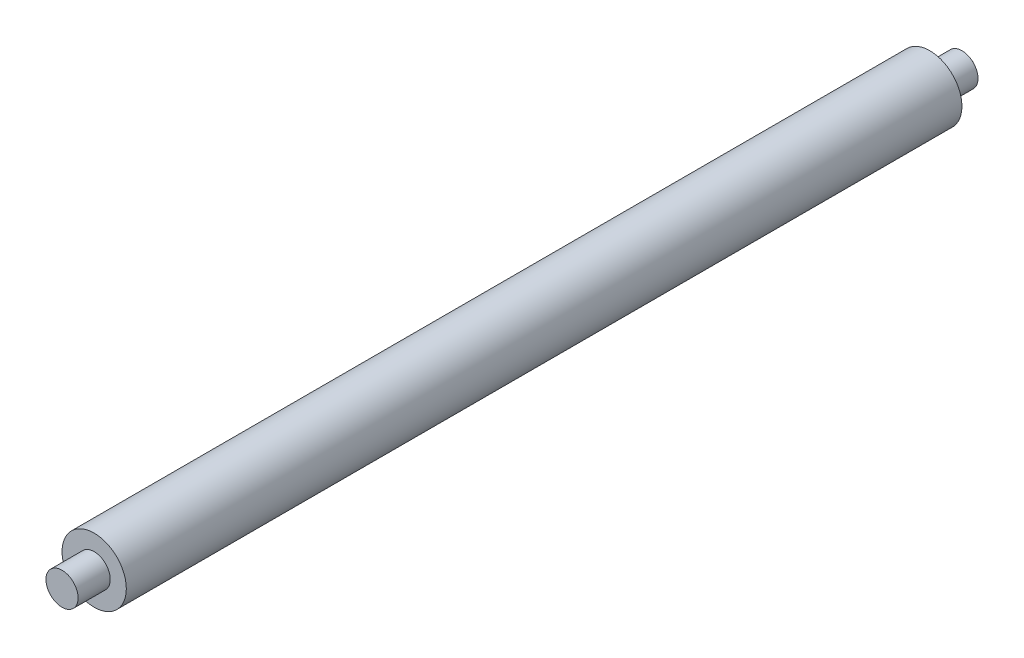
ISO-10303-21;
HEADER;
FILE_DESCRIPTION(('STEP AP214'),'2;1');
FILE_NAME('part.step','',(''),(''),'','','');
FILE_SCHEMA(('AUTOMOTIVE_DESIGN { 1 0 10303 214 1 1 1 1 }'));
ENDSEC;
DATA;
#1=APPLICATION_CONTEXT('core data for automotive mechanical design processes');
#2=APPLICATION_PROTOCOL_DEFINITION('international standard','automotive_design',2000,#1);
#3=PRODUCT_CONTEXT('',#1,'mechanical');
#4=PRODUCT('Part','Part','',(#3));
#5=PRODUCT_RELATED_PRODUCT_CATEGORY('part','',(#4));
#6=PRODUCT_DEFINITION_FORMATION('','',#4);
#7=PRODUCT_DEFINITION_CONTEXT('part definition',#1,'design');
#8=PRODUCT_DEFINITION('design','',#6,#7);
#9=PRODUCT_DEFINITION_SHAPE('','',#8);
#10=(LENGTH_UNIT() NAMED_UNIT(*) SI_UNIT(.MILLI.,.METRE.));
#11=(NAMED_UNIT(*) PLANE_ANGLE_UNIT() SI_UNIT($,.RADIAN.));
#12=(NAMED_UNIT(*) SI_UNIT($,.STERADIAN.) SOLID_ANGLE_UNIT());
#13=UNCERTAINTY_MEASURE_WITH_UNIT(LENGTH_MEASURE(1.E-05),#10,'distance_accuracy_value','');
#14=(GEOMETRIC_REPRESENTATION_CONTEXT(3) GLOBAL_UNCERTAINTY_ASSIGNED_CONTEXT((#13)) GLOBAL_UNIT_ASSIGNED_CONTEXT((#10,
#11,#12)) REPRESENTATION_CONTEXT('',''));
#15=CARTESIAN_POINT('',(0.,0.,0.));
#16=DIRECTION('',(0.,0.,1.));
#17=DIRECTION('',(1.,0.,0.));
#18=AXIS2_PLACEMENT_3D('',#15,#16,#17);
#19=CARTESIAN_POINT('',(0.,0.,5.));
#20=DIRECTION('',(0.,0.,-1.));
#21=DIRECTION('',(-1.,0.,0.));
#22=AXIS2_PLACEMENT_3D('',#19,#20,#21);
#23=CYLINDRICAL_SURFACE('',#22,2.5);
#24=CARTESIAN_POINT('',(0.,0.,5.));
#25=DIRECTION('',(0.,0.,1.));
#26=DIRECTION('',(1.,0.,0.));
#27=AXIS2_PLACEMENT_3D('',#24,#25,#26);
#28=CIRCLE('',#27,2.5);
#29=CARTESIAN_POINT('',(2.5,0.,5.));
#30=VERTEX_POINT('',#29);
#31=EDGE_CURVE('E42',#30,#30,#28,.T.);
#32=ORIENTED_EDGE('',*,*,#31,.F.);
#33=EDGE_LOOP('',(#32));
#34=FACE_BOUND('',#33,.T.);
#35=CARTESIAN_POINT('',(0.,0.,0.));
#36=DIRECTION('',(0.,0.,1.));
#37=DIRECTION('',(1.,0.,0.));
#38=AXIS2_PLACEMENT_3D('',#35,#36,#37);
#39=CIRCLE('',#38,2.5);
#40=CARTESIAN_POINT('',(2.5,0.,0.));
#41=VERTEX_POINT('',#40);
#42=EDGE_CURVE('E38',#41,#41,#39,.T.);
#43=ORIENTED_EDGE('',*,*,#42,.T.);
#44=EDGE_LOOP('',(#43));
#45=FACE_BOUND('',#44,.T.);
#46=ADVANCED_FACE('F35',(#34,#45),#23,.T.);
#47=CARTESIAN_POINT('',(0.,0.,0.));
#48=DIRECTION('',(0.,0.,1.));
#49=DIRECTION('',(1.,0.,0.));
#50=AXIS2_PLACEMENT_3D('',#47,#48,#49);
#51=PLANE('',#50);
#52=ORIENTED_EDGE('',*,*,#42,.F.);
#53=EDGE_LOOP('',(#52));
#54=FACE_BOUND('',#53,.T.);
#55=ADVANCED_FACE('F76',(#54),#51,.F.);
#56=CARTESIAN_POINT('',(0.,0.,135.));
#57=DIRECTION('',(0.,0.,-1.));
#58=DIRECTION('',(-1.,0.,0.));
#59=AXIS2_PLACEMENT_3D('',#56,#57,#58);
#60=CYLINDRICAL_SURFACE('',#59,5.);
#61=CARTESIAN_POINT('',(0.,0.,135.));
#62=DIRECTION('',(0.,0.,1.));
#63=DIRECTION('',(1.,0.,0.));
#64=AXIS2_PLACEMENT_3D('',#61,#62,#63);
#65=CIRCLE('',#64,5.);
#66=CARTESIAN_POINT('',(5.,0.,135.));
#67=VERTEX_POINT('',#66);
#68=EDGE_CURVE('E50',#67,#67,#65,.T.);
#69=ORIENTED_EDGE('',*,*,#68,.F.);
#70=EDGE_LOOP('',(#69));
#71=FACE_BOUND('',#70,.T.);
#72=CARTESIAN_POINT('',(0.,0.,5.));
#73=DIRECTION('',(0.,0.,1.));
#74=DIRECTION('',(1.,0.,0.));
#75=AXIS2_PLACEMENT_3D('',#72,#73,#74);
#76=CIRCLE('',#75,5.);
#77=CARTESIAN_POINT('',(5.,0.,5.));
#78=VERTEX_POINT('',#77);
#79=EDGE_CURVE('E53',#78,#78,#76,.T.);
#80=ORIENTED_EDGE('',*,*,#79,.T.);
#81=EDGE_LOOP('',(#80));
#82=FACE_BOUND('',#81,.T.);
#83=ADVANCED_FACE('F81',(#71,#82),#60,.T.);
#84=CARTESIAN_POINT('',(0.,0.,135.));
#85=DIRECTION('',(0.,0.,1.));
#86=DIRECTION('',(1.,0.,0.));
#87=AXIS2_PLACEMENT_3D('',#84,#85,#86);
#88=PLANE('',#87);
#89=CARTESIAN_POINT('',(0.,0.,135.));
#90=DIRECTION('',(0.,0.,1.));
#91=DIRECTION('',(1.,0.,0.));
#92=AXIS2_PLACEMENT_3D('',#89,#90,#91);
#93=CIRCLE('',#92,2.5);
#94=CARTESIAN_POINT('',(2.5,0.,135.));
#95=VERTEX_POINT('',#94);
#96=EDGE_CURVE('E10',#95,#95,#93,.T.);
#97=ORIENTED_EDGE('',*,*,#96,.F.);
#98=EDGE_LOOP('',(#97));
#99=FACE_BOUND('',#98,.T.);
#100=ORIENTED_EDGE('',*,*,#68,.T.);
#101=EDGE_LOOP('',(#100));
#102=FACE_BOUND('',#101,.T.);
#103=ADVANCED_FACE('F71',(#99,#102),#88,.T.);
#104=CARTESIAN_POINT('',(0.,0.,5.));
#105=DIRECTION('',(0.,0.,1.));
#106=DIRECTION('',(1.,0.,0.));
#107=AXIS2_PLACEMENT_3D('',#104,#105,#106);
#108=PLANE('',#107);
#109=ORIENTED_EDGE('',*,*,#31,.T.);
#110=EDGE_LOOP('',(#109));
#111=FACE_BOUND('',#110,.T.);
#112=ORIENTED_EDGE('',*,*,#79,.F.);
#113=EDGE_LOOP('',(#112));
#114=FACE_BOUND('',#113,.T.);
#115=ADVANCED_FACE('F64',(#111,#114),#108,.F.);
#116=CARTESIAN_POINT('',(0.,0.,140.));
#117=DIRECTION('',(0.,0.,-1.));
#118=DIRECTION('',(-1.,0.,0.));
#119=AXIS2_PLACEMENT_3D('',#116,#117,#118);
#120=CYLINDRICAL_SURFACE('',#119,2.5);
#121=CARTESIAN_POINT('',(0.,0.,140.));
#122=DIRECTION('',(0.,0.,1.));
#123=DIRECTION('',(1.,0.,0.));
#124=AXIS2_PLACEMENT_3D('',#121,#122,#123);
#125=CIRCLE('',#124,2.5);
#126=CARTESIAN_POINT('',(2.5,0.,140.));
#127=VERTEX_POINT('',#126);
#128=EDGE_CURVE('E49',#127,#127,#125,.T.);
#129=ORIENTED_EDGE('',*,*,#128,.F.);
#130=EDGE_LOOP('',(#129));
#131=FACE_BOUND('',#130,.T.);
#132=ORIENTED_EDGE('',*,*,#96,.T.);
#133=EDGE_LOOP('',(#132));
#134=FACE_BOUND('',#133,.T.);
#135=ADVANCED_FACE('F62',(#131,#134),#120,.T.);
#136=CARTESIAN_POINT('',(0.,0.,140.));
#137=DIRECTION('',(0.,0.,1.));
#138=DIRECTION('',(1.,0.,0.));
#139=AXIS2_PLACEMENT_3D('',#136,#137,#138);
#140=PLANE('',#139);
#141=ORIENTED_EDGE('',*,*,#128,.T.);
#142=EDGE_LOOP('',(#141));
#143=FACE_BOUND('',#142,.T.);
#144=ADVANCED_FACE('F60',(#143),#140,.T.);
#145=CLOSED_SHELL('',(#46,#55,#83,#103,#115,#135,#144));
#146=MANIFOLD_SOLID_BREP('B2',#145);
#147=ADVANCED_BREP_SHAPE_REPRESENTATION('',(#18,#146),#14);
#148=SHAPE_DEFINITION_REPRESENTATION(#9,#147);
ENDSEC;
END-ISO-10303-21;
